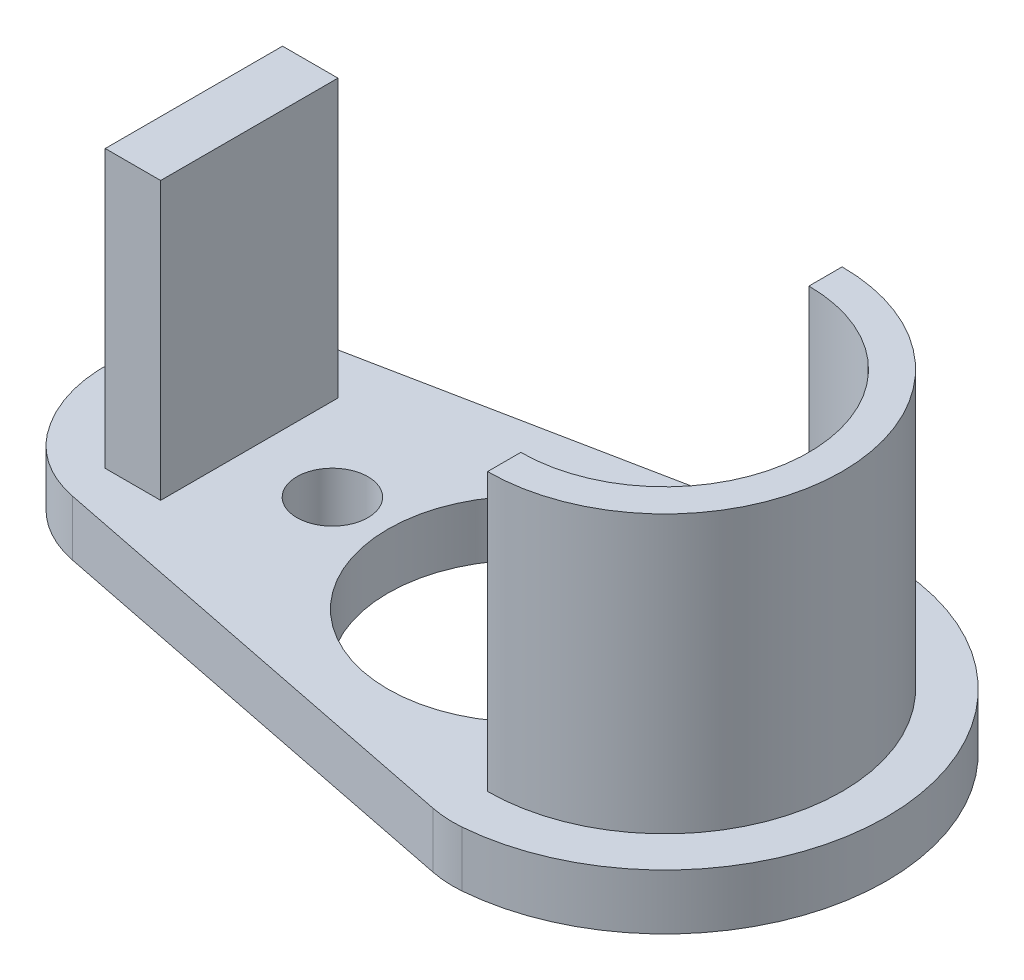
ISO-10303-21;
HEADER;
FILE_DESCRIPTION(('STEP AP214'),'2;1');
FILE_NAME('part.step','',(''),(''),'','','');
FILE_SCHEMA(('AUTOMOTIVE_DESIGN { 1 0 10303 214 1 1 1 1 }'));
ENDSEC;
DATA;
#1=APPLICATION_CONTEXT('core data for automotive mechanical design processes');
#2=APPLICATION_PROTOCOL_DEFINITION('international standard','automotive_design',2000,#1);
#3=PRODUCT_CONTEXT('',#1,'mechanical');
#4=PRODUCT('Part','Part','',(#3));
#5=PRODUCT_RELATED_PRODUCT_CATEGORY('part','',(#4));
#6=PRODUCT_DEFINITION_FORMATION('','',#4);
#7=PRODUCT_DEFINITION_CONTEXT('part definition',#1,'design');
#8=PRODUCT_DEFINITION('design','',#6,#7);
#9=PRODUCT_DEFINITION_SHAPE('','',#8);
#10=(LENGTH_UNIT() NAMED_UNIT(*) SI_UNIT(.MILLI.,.METRE.));
#11=(NAMED_UNIT(*) PLANE_ANGLE_UNIT() SI_UNIT($,.RADIAN.));
#12=(NAMED_UNIT(*) SI_UNIT($,.STERADIAN.) SOLID_ANGLE_UNIT());
#13=UNCERTAINTY_MEASURE_WITH_UNIT(LENGTH_MEASURE(1.E-05),#10,'distance_accuracy_value','');
#14=(GEOMETRIC_REPRESENTATION_CONTEXT(3) GLOBAL_UNCERTAINTY_ASSIGNED_CONTEXT((#13)) GLOBAL_UNIT_ASSIGNED_CONTEXT((#10,
#11,#12)) REPRESENTATION_CONTEXT('',''));
#15=CARTESIAN_POINT('',(0.,0.,0.));
#16=DIRECTION('',(0.,0.,1.));
#17=DIRECTION('',(1.,0.,0.));
#18=AXIS2_PLACEMENT_3D('',#15,#16,#17);
#19=CARTESIAN_POINT('',(0.,0.5,0.));
#20=DIRECTION('',(0.,1.,0.));
#21=DIRECTION('',(0.,0.,1.));
#22=AXIS2_PLACEMENT_3D('',#19,#20,#21);
#23=PLANE('',#22);
#24=CARTESIAN_POINT('',(-3.,0.5,0.));
#25=DIRECTION('',(0.,1.,0.));
#26=DIRECTION('',(0.,0.,1.));
#27=AXIS2_PLACEMENT_3D('',#24,#25,#26);
#28=CIRCLE('',#27,0.3207);
#29=CARTESIAN_POINT('',(-3.,0.5,0.3207));
#30=VERTEX_POINT('',#29);
#31=EDGE_CURVE('E239',#30,#30,#28,.T.);
#32=ORIENTED_EDGE('',*,*,#31,.F.);
#33=EDGE_LOOP('',(#32));
#34=FACE_BOUND('',#33,.T.);
#35=CARTESIAN_POINT('',(-1.24999999999968,0.5,0.));
#36=DIRECTION('',(0.,1.,0.));
#37=DIRECTION('',(0.,0.,1.));
#38=AXIS2_PLACEMENT_3D('',#35,#36,#37);
#39=CIRCLE('',#38,1.24999999999969);
#40=CARTESIAN_POINT('',(-1.24999999999968,0.5,1.24999999999969));
#41=VERTEX_POINT('',#40);
#42=EDGE_CURVE('E236',#41,#41,#39,.T.);
#43=ORIENTED_EDGE('',*,*,#42,.F.);
#44=EDGE_LOOP('',(#43));
#45=FACE_BOUND('',#44,.T.);
#46=CARTESIAN_POINT('',(0.5,0.5,0.));
#47=DIRECTION('',(0.,1.,0.));
#48=DIRECTION('',(0.,0.,1.));
#49=AXIS2_PLACEMENT_3D('',#46,#47,#48);
#50=CIRCLE('',#49,0.3207);
#51=CARTESIAN_POINT('',(0.5,0.5,0.3207));
#52=VERTEX_POINT('',#51);
#53=EDGE_CURVE('E233',#52,#52,#50,.T.);
#54=ORIENTED_EDGE('',*,*,#53,.F.);
#55=EDGE_LOOP('',(#54));
#56=FACE_BOUND('',#55,.T.);
#57=DIRECTION('',(-0.980617043355843,0.,0.195934209060197));
#58=VECTOR('',#57,1.);
#59=CARTESIAN_POINT('',(-0.384272849561752,0.5,-1.92321957143991));
#60=LINE('',#59,#58);
#61=CARTESIAN_POINT('',(-0.113883759060197,0.5,-1.97724522084595));
#62=VERTEX_POINT('',#61);
#63=CARTESIAN_POINT('',(-4.183235690524,0.5,-1.16415997265328));
#64=VERTEX_POINT('',#63);
#65=EDGE_CURVE('E212',#62,#64,#60,.T.);
#66=ORIENTED_EDGE('',*,*,#65,.T.);
#67=CARTESIAN_POINT('',(-3.9873014814638,0.5,-0.183542929297438));
#68=DIRECTION('',(0.,1.,0.));
#69=DIRECTION('',(0.,0.,1.));
#70=AXIS2_PLACEMENT_3D('',#67,#68,#69);
#71=CIRCLE('',#70,1.);
#72=CARTESIAN_POINT('',(-4.77830641967648,0.5,-0.795352693622231));
#73=VERTEX_POINT('',#72);
#74=EDGE_CURVE('E215',#64,#73,#71,.T.);
#75=ORIENTED_EDGE('',*,*,#74,.T.);
#76=CARTESIAN_POINT('',(-3.75,0.5,0.));
#77=DIRECTION('',(0.,1.,0.));
#78=DIRECTION('',(0.,0.,1.));
#79=AXIS2_PLACEMENT_3D('',#76,#77,#78);
#80=CIRCLE('',#79,1.3);
#81=CARTESIAN_POINT('',(-4.77830641967648,0.5,0.795352693622231));
#82=VERTEX_POINT('',#81);
#83=EDGE_CURVE('E218',#73,#82,#80,.T.);
#84=ORIENTED_EDGE('',*,*,#83,.T.);
#85=CARTESIAN_POINT('',(-3.9873014814638,0.5,0.183542929297438));
#86=DIRECTION('',(0.,1.,0.));
#87=DIRECTION('',(0.,0.,1.));
#88=AXIS2_PLACEMENT_3D('',#85,#86,#87);
#89=CIRCLE('',#88,1.);
#90=CARTESIAN_POINT('',(-4.183235690524,0.5,1.16415997265328));
#91=VERTEX_POINT('',#90);
#92=EDGE_CURVE('E220',#91,#82,#89,.F.);
#93=ORIENTED_EDGE('',*,*,#92,.F.);
#94=DIRECTION('',(-0.980617043355843,0.,-0.195934209060197));
#95=VECTOR('',#94,1.);
#96=CARTESIAN_POINT('',(-0.384272849561752,0.5,1.92321957143991));
#97=LINE('',#96,#95);
#98=CARTESIAN_POINT('',(-0.113883759971435,0.5,1.97724522066388));
#99=VERTEX_POINT('',#98);
#100=EDGE_CURVE('E223',#99,#91,#97,.T.);
#101=ORIENTED_EDGE('',*,*,#100,.F.);
#102=CARTESIAN_POINT('',(0.0820504490887623,0.5,0.996628177308034));
#103=DIRECTION('',(0.,1.,0.));
#104=DIRECTION('',(0.,0.,1.));
#105=AXIS2_PLACEMENT_3D('',#102,#103,#104);
#106=CIRCLE('',#105,1.);
#107=CARTESIAN_POINT('',(0.164100898177525,0.5,1.99325635461607));
#108=VERTEX_POINT('',#107);
#109=EDGE_CURVE('E226',#99,#108,#106,.T.);
#110=ORIENTED_EDGE('',*,*,#109,.T.);
#111=CARTESIAN_POINT('',(-1.05819487287301E-11,0.5,-1.28546370596616E-10));
#112=DIRECTION('',(0.,1.,0.));
#113=DIRECTION('',(0.,0.,1.));
#114=AXIS2_PLACEMENT_3D('',#111,#112,#113);
#115=CIRCLE('',#114,2.00000000012898);
#116=CARTESIAN_POINT('',(0.164100899999999,0.5,-1.99325635472312));
#117=VERTEX_POINT('',#116);
#118=EDGE_CURVE('E228',#117,#108,#115,.F.);
#119=ORIENTED_EDGE('',*,*,#118,.F.);
#120=CARTESIAN_POINT('',(0.0820504499999999,0.5,-0.996628177490106));
#121=DIRECTION('',(0.,1.,0.));
#122=DIRECTION('',(0.,0.,1.));
#123=AXIS2_PLACEMENT_3D('',#120,#121,#122);
#124=CIRCLE('',#123,1.);
#125=EDGE_CURVE('E231',#117,#62,#124,.T.);
#126=ORIENTED_EDGE('',*,*,#125,.T.);
#127=EDGE_LOOP('',(#66,#75,#84,#93,#101,#110,#119,#126));
#128=FACE_BOUND('',#127,.T.);
#129=DIRECTION('',(0.,0.,-1.));
#130=VECTOR('',#129,1.);
#131=CARTESIAN_POINT('',(-3.75,0.5,0.));
#132=LINE('',#131,#130);
#133=CARTESIAN_POINT('',(-3.75,0.5,0.8));
#134=VERTEX_POINT('',#133);
#135=CARTESIAN_POINT('',(-3.75,0.5,-0.8));
#136=VERTEX_POINT('',#135);
#137=EDGE_CURVE('E209',#134,#136,#132,.T.);
#138=ORIENTED_EDGE('',*,*,#137,.F.);
#139=DIRECTION('',(-1.,0.,0.));
#140=VECTOR('',#139,1.);
#141=CARTESIAN_POINT('',(0.,0.5,0.8));
#142=LINE('',#141,#140);
#143=CARTESIAN_POINT('',(-4.25,0.5,0.8));
#144=VERTEX_POINT('',#143);
#145=EDGE_CURVE('E201',#134,#144,#142,.T.);
#146=ORIENTED_EDGE('',*,*,#145,.T.);
#147=DIRECTION('',(0.,0.,-1.));
#148=VECTOR('',#147,1.);
#149=CARTESIAN_POINT('',(-4.25,0.5,0.));
#150=LINE('',#149,#148);
#151=CARTESIAN_POINT('',(-4.25,0.5,-0.8));
#152=VERTEX_POINT('',#151);
#153=EDGE_CURVE('E204',#144,#152,#150,.T.);
#154=ORIENTED_EDGE('',*,*,#153,.T.);
#155=DIRECTION('',(-1.,0.,0.));
#156=VECTOR('',#155,1.);
#157=CARTESIAN_POINT('',(0.,0.5,-0.8));
#158=LINE('',#157,#156);
#159=EDGE_CURVE('E207',#136,#152,#158,.T.);
#160=ORIENTED_EDGE('',*,*,#159,.F.);
#161=EDGE_LOOP('',(#138,#146,#154,#160));
#162=FACE_BOUND('',#161,.T.);
#163=CARTESIAN_POINT('',(-1.05819487287301E-11,0.5,-1.28546370596616E-10));
#164=DIRECTION('',(0.,1.,0.));
#165=DIRECTION('',(0.,0.,1.));
#166=AXIS2_PLACEMENT_3D('',#163,#164,#165);
#167=CIRCLE('',#166,1.3);
#168=CARTESIAN_POINT('',(-1.0582065822565E-11,0.5,1.29999999987145));
#169=VERTEX_POINT('',#168);
#170=CARTESIAN_POINT('',(-1.0582065822565E-11,0.5,-1.30000000012855));
#171=VERTEX_POINT('',#170);
#172=EDGE_CURVE('E51',#169,#171,#167,.T.);
#173=ORIENTED_EDGE('',*,*,#172,.T.);
#174=DIRECTION('',(0.,0.,-1.));
#175=VECTOR('',#174,1.);
#176=CARTESIAN_POINT('',(-1.05825008262379E-11,0.5,0.));
#177=LINE('',#176,#175);
#178=CARTESIAN_POINT('',(-1.05819654371021E-11,0.5,-1.60000000012855));
#179=VERTEX_POINT('',#178);
#180=EDGE_CURVE('E168',#171,#179,#177,.T.);
#181=ORIENTED_EDGE('',*,*,#180,.T.);
#182=CARTESIAN_POINT('',(-1.05819487287301E-11,0.5,-1.28546370596616E-10));
#183=DIRECTION('',(0.,1.,0.));
#184=DIRECTION('',(0.,0.,1.));
#185=AXIS2_PLACEMENT_3D('',#182,#183,#184);
#186=CIRCLE('',#185,1.6);
#187=CARTESIAN_POINT('',(-1.05819487287301E-11,0.5,1.59999999987145));
#188=VERTEX_POINT('',#187);
#189=EDGE_CURVE('E169',#188,#179,#186,.T.);
#190=ORIENTED_EDGE('',*,*,#189,.F.);
#191=DIRECTION('',(0.,0.,-1.));
#192=VECTOR('',#191,1.);
#193=CARTESIAN_POINT('',(-1.05825008262378E-11,0.5,0.));
#194=LINE('',#193,#192);
#195=EDGE_CURVE('E56',#188,#169,#194,.T.);
#196=ORIENTED_EDGE('',*,*,#195,.T.);
#197=EDGE_LOOP('',(#173,#181,#190,#196));
#198=FACE_BOUND('',#197,.T.);
#199=ADVANCED_FACE('F36',(#34,#45,#56,#128,#162,#198),#23,.T.);
#200=CARTESIAN_POINT('',(-0.384272849561752,0.5,-1.92321957143991));
#201=DIRECTION('',(0.195934209060197,0.,0.980617043355843));
#202=DIRECTION('',(0.980617043355843,0.,-0.195934209060197));
#203=AXIS2_PLACEMENT_3D('',#200,#201,#202);
#204=PLANE('',#203);
#205=DIRECTION('',(-0.980617043355843,0.,0.195934209060197));
#206=VECTOR('',#205,1.);
#207=CARTESIAN_POINT('',(-0.384272849561752,0.,-1.92321957143991));
#208=LINE('',#207,#206);
#209=CARTESIAN_POINT('',(-0.113883759060197,0.,-1.97724522084595));
#210=VERTEX_POINT('',#209);
#211=CARTESIAN_POINT('',(-4.183235690524,0.,-1.16415997265328));
#212=VERTEX_POINT('',#211);
#213=EDGE_CURVE('E211',#210,#212,#208,.T.);
#214=ORIENTED_EDGE('',*,*,#213,.T.);
#215=DIRECTION('',(0.,-1.,0.));
#216=VECTOR('',#215,1.);
#217=CARTESIAN_POINT('',(-4.183235690524,0.5,-1.16415997265328));
#218=LINE('',#217,#216);
#219=EDGE_CURVE('E11',#64,#212,#218,.T.);
#220=ORIENTED_EDGE('',*,*,#219,.F.);
#221=ORIENTED_EDGE('',*,*,#65,.F.);
#222=DIRECTION('',(0.,-1.,0.));
#223=VECTOR('',#222,1.);
#224=CARTESIAN_POINT('',(-0.113883759060197,0.5,-1.97724522084595));
#225=LINE('',#224,#223);
#226=EDGE_CURVE('E242',#62,#210,#225,.T.);
#227=ORIENTED_EDGE('',*,*,#226,.T.);
#228=EDGE_LOOP('',(#214,#220,#221,#227));
#229=FACE_BOUND('',#228,.T.);
#230=ADVANCED_FACE('F38',(#229),#204,.F.);
#231=CARTESIAN_POINT('',(-3.9873014814638,0.5,-0.183542929297438));
#232=DIRECTION('',(0.,-1.,0.));
#233=DIRECTION('',(0.,0.,-1.));
#234=AXIS2_PLACEMENT_3D('',#231,#232,#233);
#235=CYLINDRICAL_SURFACE('',#234,1.);
#236=CARTESIAN_POINT('',(-3.9873014814638,0.,-0.183542929297438));
#237=DIRECTION('',(0.,1.,0.));
#238=DIRECTION('',(0.,0.,1.));
#239=AXIS2_PLACEMENT_3D('',#236,#237,#238);
#240=CIRCLE('',#239,1.);
#241=CARTESIAN_POINT('',(-4.77830641967648,0.,-0.795352693622231));
#242=VERTEX_POINT('',#241);
#243=EDGE_CURVE('E245',#212,#242,#240,.T.);
#244=ORIENTED_EDGE('',*,*,#243,.T.);
#245=DIRECTION('',(0.,-1.,0.));
#246=VECTOR('',#245,1.);
#247=CARTESIAN_POINT('',(-4.77830641967648,0.5,-0.795352693622231));
#248=LINE('',#247,#246);
#249=EDGE_CURVE('E44',#73,#242,#248,.T.);
#250=ORIENTED_EDGE('',*,*,#249,.F.);
#251=ORIENTED_EDGE('',*,*,#74,.F.);
#252=ORIENTED_EDGE('',*,*,#219,.T.);
#253=EDGE_LOOP('',(#244,#250,#251,#252));
#254=FACE_BOUND('',#253,.T.);
#255=ADVANCED_FACE('F321',(#254),#235,.T.);
#256=CARTESIAN_POINT('',(-3.75,0.5,0.));
#257=DIRECTION('',(0.,-1.,0.));
#258=DIRECTION('',(0.,0.,-1.));
#259=AXIS2_PLACEMENT_3D('',#256,#257,#258);
#260=CYLINDRICAL_SURFACE('',#259,1.3);
#261=CARTESIAN_POINT('',(-3.75,0.,0.));
#262=DIRECTION('',(0.,1.,0.));
#263=DIRECTION('',(0.,0.,1.));
#264=AXIS2_PLACEMENT_3D('',#261,#262,#263);
#265=CIRCLE('',#264,1.3);
#266=CARTESIAN_POINT('',(-4.77830641967648,0.,0.795352693622231));
#267=VERTEX_POINT('',#266);
#268=EDGE_CURVE('E247',#242,#267,#265,.T.);
#269=ORIENTED_EDGE('',*,*,#268,.T.);
#270=DIRECTION('',(0.,-1.,0.));
#271=VECTOR('',#270,1.);
#272=CARTESIAN_POINT('',(-4.77830641967648,0.5,0.795352693622231));
#273=LINE('',#272,#271);
#274=EDGE_CURVE('E282',#82,#267,#273,.T.);
#275=ORIENTED_EDGE('',*,*,#274,.F.);
#276=ORIENTED_EDGE('',*,*,#83,.F.);
#277=ORIENTED_EDGE('',*,*,#249,.T.);
#278=EDGE_LOOP('',(#269,#275,#276,#277));
#279=FACE_BOUND('',#278,.T.);
#280=ADVANCED_FACE('F288',(#279),#260,.T.);
#281=CARTESIAN_POINT('',(-3.9873014814638,0.5,0.183542929297438));
#282=DIRECTION('',(0.,-1.,0.));
#283=DIRECTION('',(0.,0.,-1.));
#284=AXIS2_PLACEMENT_3D('',#281,#282,#283);
#285=CYLINDRICAL_SURFACE('',#284,1.);
#286=CARTESIAN_POINT('',(-3.9873014814638,0.,0.183542929297438));
#287=DIRECTION('',(0.,1.,0.));
#288=DIRECTION('',(0.,0.,1.));
#289=AXIS2_PLACEMENT_3D('',#286,#287,#288);
#290=CIRCLE('',#289,1.);
#291=CARTESIAN_POINT('',(-4.183235690524,0.,1.16415997265328));
#292=VERTEX_POINT('',#291);
#293=EDGE_CURVE('E250',#292,#267,#290,.F.);
#294=ORIENTED_EDGE('',*,*,#293,.F.);
#295=DIRECTION('',(0.,-1.,0.));
#296=VECTOR('',#295,1.);
#297=CARTESIAN_POINT('',(-4.183235690524,0.5,1.16415997265328));
#298=LINE('',#297,#296);
#299=EDGE_CURVE('E280',#91,#292,#298,.T.);
#300=ORIENTED_EDGE('',*,*,#299,.F.);
#301=ORIENTED_EDGE('',*,*,#92,.T.);
#302=ORIENTED_EDGE('',*,*,#274,.T.);
#303=EDGE_LOOP('',(#294,#300,#301,#302));
#304=FACE_BOUND('',#303,.T.);
#305=ADVANCED_FACE('F298',(#304),#285,.T.);
#306=CARTESIAN_POINT('',(-0.384272849561752,0.5,1.92321957143991));
#307=DIRECTION('',(-0.195934209060197,0.,0.980617043355843));
#308=DIRECTION('',(0.980617043355843,0.,0.195934209060197));
#309=AXIS2_PLACEMENT_3D('',#306,#307,#308);
#310=PLANE('',#309);
#311=DIRECTION('',(-0.980617043355843,0.,-0.195934209060197));
#312=VECTOR('',#311,1.);
#313=CARTESIAN_POINT('',(-0.384272849561752,0.,1.92321957143991));
#314=LINE('',#313,#312);
#315=CARTESIAN_POINT('',(-0.113883759971435,0.,1.97724522066388));
#316=VERTEX_POINT('',#315);
#317=EDGE_CURVE('E253',#316,#292,#314,.T.);
#318=ORIENTED_EDGE('',*,*,#317,.F.);
#319=DIRECTION('',(0.,-1.,0.));
#320=VECTOR('',#319,1.);
#321=CARTESIAN_POINT('',(-0.113883759971435,0.5,1.97724522066388));
#322=LINE('',#321,#320);
#323=EDGE_CURVE('E278',#99,#316,#322,.T.);
#324=ORIENTED_EDGE('',*,*,#323,.F.);
#325=ORIENTED_EDGE('',*,*,#100,.T.);
#326=ORIENTED_EDGE('',*,*,#299,.T.);
#327=EDGE_LOOP('',(#318,#324,#325,#326));
#328=FACE_BOUND('',#327,.T.);
#329=ADVANCED_FACE('F304',(#328),#310,.T.);
#330=CARTESIAN_POINT('',(0.0820504490887623,0.5,0.996628177308034));
#331=DIRECTION('',(0.,-1.,0.));
#332=DIRECTION('',(0.,0.,-1.));
#333=AXIS2_PLACEMENT_3D('',#330,#331,#332);
#334=CYLINDRICAL_SURFACE('',#333,1.);
#335=CARTESIAN_POINT('',(0.0820504490887623,0.,0.996628177308034));
#336=DIRECTION('',(0.,1.,0.));
#337=DIRECTION('',(0.,0.,1.));
#338=AXIS2_PLACEMENT_3D('',#335,#336,#337);
#339=CIRCLE('',#338,1.);
#340=CARTESIAN_POINT('',(0.164100898177525,0.,1.99325635461607));
#341=VERTEX_POINT('',#340);
#342=EDGE_CURVE('E256',#316,#341,#339,.T.);
#343=ORIENTED_EDGE('',*,*,#342,.T.);
#344=DIRECTION('',(0.,-1.,0.));
#345=VECTOR('',#344,1.);
#346=CARTESIAN_POINT('',(0.164100898177525,0.5,1.99325635461607));
#347=LINE('',#346,#345);
#348=EDGE_CURVE('E276',#108,#341,#347,.T.);
#349=ORIENTED_EDGE('',*,*,#348,.F.);
#350=ORIENTED_EDGE('',*,*,#109,.F.);
#351=ORIENTED_EDGE('',*,*,#323,.T.);
#352=EDGE_LOOP('',(#343,#349,#350,#351));
#353=FACE_BOUND('',#352,.T.);
#354=ADVANCED_FACE('F308',(#353),#334,.T.);
#355=CARTESIAN_POINT('',(-1.05819487287301E-11,0.5,-1.28546370596616E-10));
#356=DIRECTION('',(0.,-1.,0.));
#357=DIRECTION('',(0.,0.,-1.));
#358=AXIS2_PLACEMENT_3D('',#355,#356,#357);
#359=CYLINDRICAL_SURFACE('',#358,2.00000000012898);
#360=CARTESIAN_POINT('',(-1.05819487287301E-11,0.,-1.28546370596616E-10));
#361=DIRECTION('',(0.,1.,0.));
#362=DIRECTION('',(0.,0.,1.));
#363=AXIS2_PLACEMENT_3D('',#360,#361,#362);
#364=CIRCLE('',#363,2.00000000012898);
#365=CARTESIAN_POINT('',(0.164100899999999,0.,-1.99325635472312));
#366=VERTEX_POINT('',#365);
#367=EDGE_CURVE('E259',#366,#341,#364,.F.);
#368=ORIENTED_EDGE('',*,*,#367,.F.);
#369=DIRECTION('',(0.,-1.,0.));
#370=VECTOR('',#369,1.);
#371=CARTESIAN_POINT('',(0.164100899999999,0.5,-1.99325635472312));
#372=LINE('',#371,#370);
#373=EDGE_CURVE('E274',#117,#366,#372,.T.);
#374=ORIENTED_EDGE('',*,*,#373,.F.);
#375=ORIENTED_EDGE('',*,*,#118,.T.);
#376=ORIENTED_EDGE('',*,*,#348,.T.);
#377=EDGE_LOOP('',(#368,#374,#375,#376));
#378=FACE_BOUND('',#377,.T.);
#379=ADVANCED_FACE('F314',(#378),#359,.T.);
#380=CARTESIAN_POINT('',(-1.24999999999968,0.5,0.));
#381=DIRECTION('',(0.,-1.,0.));
#382=DIRECTION('',(0.,0.,-1.));
#383=AXIS2_PLACEMENT_3D('',#380,#381,#382);
#384=CYLINDRICAL_SURFACE('',#383,1.24999999999969);
#385=ORIENTED_EDGE('',*,*,#42,.T.);
#386=EDGE_LOOP('',(#385));
#387=FACE_BOUND('',#386,.T.);
#388=CARTESIAN_POINT('',(-1.24999999999968,0.,0.));
#389=DIRECTION('',(0.,1.,0.));
#390=DIRECTION('',(0.,0.,1.));
#391=AXIS2_PLACEMENT_3D('',#388,#389,#390);
#392=CIRCLE('',#391,1.24999999999969);
#393=CARTESIAN_POINT('',(-1.24999999999968,0.,1.24999999999969));
#394=VERTEX_POINT('',#393);
#395=EDGE_CURVE('E267',#394,#394,#392,.T.);
#396=ORIENTED_EDGE('',*,*,#395,.F.);
#397=EDGE_LOOP('',(#396));
#398=FACE_BOUND('',#397,.T.);
#399=ADVANCED_FACE('F346',(#387,#398),#384,.F.);
#400=CARTESIAN_POINT('',(0.5,0.5,0.));
#401=DIRECTION('',(0.,-1.,0.));
#402=DIRECTION('',(0.,0.,-1.));
#403=AXIS2_PLACEMENT_3D('',#400,#401,#402);
#404=CYLINDRICAL_SURFACE('',#403,0.3207);
#405=ORIENTED_EDGE('',*,*,#53,.T.);
#406=EDGE_LOOP('',(#405));
#407=FACE_BOUND('',#406,.T.);
#408=CARTESIAN_POINT('',(0.5,0.,0.));
#409=DIRECTION('',(0.,1.,0.));
#410=DIRECTION('',(0.,0.,1.));
#411=AXIS2_PLACEMENT_3D('',#408,#409,#410);
#412=CIRCLE('',#411,0.3207);
#413=CARTESIAN_POINT('',(0.5,0.,0.3207));
#414=VERTEX_POINT('',#413);
#415=EDGE_CURVE('E264',#414,#414,#412,.T.);
#416=ORIENTED_EDGE('',*,*,#415,.F.);
#417=EDGE_LOOP('',(#416));
#418=FACE_BOUND('',#417,.T.);
#419=ADVANCED_FACE('F349',(#407,#418),#404,.F.);
#420=CARTESIAN_POINT('',(0.0820504499999999,0.5,-0.996628177490106));
#421=DIRECTION('',(0.,-1.,0.));
#422=DIRECTION('',(0.,0.,-1.));
#423=AXIS2_PLACEMENT_3D('',#420,#421,#422);
#424=CYLINDRICAL_SURFACE('',#423,1.);
#425=CARTESIAN_POINT('',(0.0820504499999999,0.,-0.996628177490106));
#426=DIRECTION('',(0.,1.,0.));
#427=DIRECTION('',(0.,0.,1.));
#428=AXIS2_PLACEMENT_3D('',#425,#426,#427);
#429=CIRCLE('',#428,1.);
#430=EDGE_CURVE('E262',#366,#210,#429,.T.);
#431=ORIENTED_EDGE('',*,*,#430,.T.);
#432=ORIENTED_EDGE('',*,*,#226,.F.);
#433=ORIENTED_EDGE('',*,*,#125,.F.);
#434=ORIENTED_EDGE('',*,*,#373,.T.);
#435=EDGE_LOOP('',(#431,#432,#433,#434));
#436=FACE_BOUND('',#435,.T.);
#437=ADVANCED_FACE('F317',(#436),#424,.T.);
#438=CARTESIAN_POINT('',(-3.,0.5,0.));
#439=DIRECTION('',(0.,-1.,0.));
#440=DIRECTION('',(0.,0.,-1.));
#441=AXIS2_PLACEMENT_3D('',#438,#439,#440);
#442=CYLINDRICAL_SURFACE('',#441,0.3207);
#443=ORIENTED_EDGE('',*,*,#31,.T.);
#444=EDGE_LOOP('',(#443));
#445=FACE_BOUND('',#444,.T.);
#446=CARTESIAN_POINT('',(-3.,0.,0.));
#447=DIRECTION('',(0.,1.,0.));
#448=DIRECTION('',(0.,0.,1.));
#449=AXIS2_PLACEMENT_3D('',#446,#447,#448);
#450=CIRCLE('',#449,0.3207);
#451=CARTESIAN_POINT('',(-3.,0.,0.3207));
#452=VERTEX_POINT('',#451);
#453=EDGE_CURVE('E216',#452,#452,#450,.T.);
#454=ORIENTED_EDGE('',*,*,#453,.F.);
#455=EDGE_LOOP('',(#454));
#456=FACE_BOUND('',#455,.T.);
#457=ADVANCED_FACE('F341',(#445,#456),#442,.F.);
#458=CARTESIAN_POINT('',(0.,0.,0.));
#459=DIRECTION('',(0.,1.,0.));
#460=DIRECTION('',(0.,0.,1.));
#461=AXIS2_PLACEMENT_3D('',#458,#459,#460);
#462=PLANE('',#461);
#463=ORIENTED_EDGE('',*,*,#453,.T.);
#464=EDGE_LOOP('',(#463));
#465=FACE_BOUND('',#464,.T.);
#466=ORIENTED_EDGE('',*,*,#395,.T.);
#467=EDGE_LOOP('',(#466));
#468=FACE_BOUND('',#467,.T.);
#469=ORIENTED_EDGE('',*,*,#415,.T.);
#470=EDGE_LOOP('',(#469));
#471=FACE_BOUND('',#470,.T.);
#472=ORIENTED_EDGE('',*,*,#213,.F.);
#473=ORIENTED_EDGE('',*,*,#430,.F.);
#474=ORIENTED_EDGE('',*,*,#367,.T.);
#475=ORIENTED_EDGE('',*,*,#342,.F.);
#476=ORIENTED_EDGE('',*,*,#317,.T.);
#477=ORIENTED_EDGE('',*,*,#293,.T.);
#478=ORIENTED_EDGE('',*,*,#268,.F.);
#479=ORIENTED_EDGE('',*,*,#243,.F.);
#480=EDGE_LOOP('',(#472,#473,#474,#475,#476,#477,#478,#479));
#481=FACE_BOUND('',#480,.T.);
#482=ADVANCED_FACE('F293',(#465,#468,#471,#481),#462,.F.);
#483=CARTESIAN_POINT('',(-3.75,3.,0.));
#484=DIRECTION('',(1.,0.,0.));
#485=DIRECTION('',(0.,0.,-1.));
#486=AXIS2_PLACEMENT_3D('',#483,#484,#485);
#487=PLANE('',#486);
#488=DIRECTION('',(0.,-1.,0.));
#489=VECTOR('',#488,1.);
#490=CARTESIAN_POINT('',(-3.75,3.,0.8));
#491=LINE('',#490,#489);
#492=CARTESIAN_POINT('',(-3.75,3.,0.8));
#493=VERTEX_POINT('',#492);
#494=EDGE_CURVE('E190',#493,#134,#491,.T.);
#495=ORIENTED_EDGE('',*,*,#494,.T.);
#496=ORIENTED_EDGE('',*,*,#137,.T.);
#497=DIRECTION('',(0.,-1.,0.));
#498=VECTOR('',#497,1.);
#499=CARTESIAN_POINT('',(-3.75,3.,-0.8));
#500=LINE('',#499,#498);
#501=CARTESIAN_POINT('',(-3.75,3.,-0.8));
#502=VERTEX_POINT('',#501);
#503=EDGE_CURVE('E198',#502,#136,#500,.T.);
#504=ORIENTED_EDGE('',*,*,#503,.F.);
#505=DIRECTION('',(0.,0.,1.));
#506=VECTOR('',#505,1.);
#507=CARTESIAN_POINT('',(-3.75,3.,0.));
#508=LINE('',#507,#506);
#509=EDGE_CURVE('E180',#502,#493,#508,.T.);
#510=ORIENTED_EDGE('',*,*,#509,.T.);
#511=EDGE_LOOP('',(#495,#496,#504,#510));
#512=FACE_BOUND('',#511,.T.);
#513=ADVANCED_FACE('F337',(#512),#487,.T.);
#514=CARTESIAN_POINT('',(0.,3.,-0.8));
#515=DIRECTION('',(0.,0.,-1.));
#516=DIRECTION('',(-1.,0.,0.));
#517=AXIS2_PLACEMENT_3D('',#514,#515,#516);
#518=PLANE('',#517);
#519=ORIENTED_EDGE('',*,*,#503,.T.);
#520=ORIENTED_EDGE('',*,*,#159,.T.);
#521=DIRECTION('',(0.,-1.,0.));
#522=VECTOR('',#521,1.);
#523=CARTESIAN_POINT('',(-4.25,3.,-0.8));
#524=LINE('',#523,#522);
#525=CARTESIAN_POINT('',(-4.25,3.,-0.8));
#526=VERTEX_POINT('',#525);
#527=EDGE_CURVE('E195',#526,#152,#524,.T.);
#528=ORIENTED_EDGE('',*,*,#527,.F.);
#529=DIRECTION('',(1.,0.,0.));
#530=VECTOR('',#529,1.);
#531=CARTESIAN_POINT('',(0.,3.,-0.8));
#532=LINE('',#531,#530);
#533=EDGE_CURVE('E183',#526,#502,#532,.T.);
#534=ORIENTED_EDGE('',*,*,#533,.T.);
#535=EDGE_LOOP('',(#519,#520,#528,#534));
#536=FACE_BOUND('',#535,.T.);
#537=ADVANCED_FACE('F405',(#536),#518,.T.);
#538=CARTESIAN_POINT('',(-4.25,3.,0.));
#539=DIRECTION('',(1.,0.,0.));
#540=DIRECTION('',(0.,0.,-1.));
#541=AXIS2_PLACEMENT_3D('',#538,#539,#540);
#542=PLANE('',#541);
#543=ORIENTED_EDGE('',*,*,#153,.F.);
#544=DIRECTION('',(0.,-1.,0.));
#545=VECTOR('',#544,1.);
#546=CARTESIAN_POINT('',(-4.25,3.,0.8));
#547=LINE('',#546,#545);
#548=CARTESIAN_POINT('',(-4.25,3.,0.8));
#549=VERTEX_POINT('',#548);
#550=EDGE_CURVE('E193',#549,#144,#547,.T.);
#551=ORIENTED_EDGE('',*,*,#550,.F.);
#552=DIRECTION('',(0.,0.,1.));
#553=VECTOR('',#552,1.);
#554=CARTESIAN_POINT('',(-4.25,3.,0.));
#555=LINE('',#554,#553);
#556=EDGE_CURVE('E186',#526,#549,#555,.T.);
#557=ORIENTED_EDGE('',*,*,#556,.F.);
#558=ORIENTED_EDGE('',*,*,#527,.T.);
#559=EDGE_LOOP('',(#543,#551,#557,#558));
#560=FACE_BOUND('',#559,.T.);
#561=ADVANCED_FACE('F412',(#560),#542,.F.);
#562=CARTESIAN_POINT('',(0.,3.,0.8));
#563=DIRECTION('',(0.,0.,-1.));
#564=DIRECTION('',(-1.,0.,0.));
#565=AXIS2_PLACEMENT_3D('',#562,#563,#564);
#566=PLANE('',#565);
#567=ORIENTED_EDGE('',*,*,#145,.F.);
#568=ORIENTED_EDGE('',*,*,#494,.F.);
#569=DIRECTION('',(1.,0.,0.));
#570=VECTOR('',#569,1.);
#571=CARTESIAN_POINT('',(0.,3.,0.8));
#572=LINE('',#571,#570);
#573=EDGE_CURVE('E188',#549,#493,#572,.T.);
#574=ORIENTED_EDGE('',*,*,#573,.F.);
#575=ORIENTED_EDGE('',*,*,#550,.T.);
#576=EDGE_LOOP('',(#567,#568,#574,#575));
#577=FACE_BOUND('',#576,.T.);
#578=ADVANCED_FACE('F419',(#577),#566,.F.);
#579=CARTESIAN_POINT('',(0.,3.,0.));
#580=DIRECTION('',(0.,1.,0.));
#581=DIRECTION('',(0.,0.,1.));
#582=AXIS2_PLACEMENT_3D('',#579,#580,#581);
#583=PLANE('',#582);
#584=ORIENTED_EDGE('',*,*,#509,.F.);
#585=ORIENTED_EDGE('',*,*,#533,.F.);
#586=ORIENTED_EDGE('',*,*,#556,.T.);
#587=ORIENTED_EDGE('',*,*,#573,.T.);
#588=EDGE_LOOP('',(#584,#585,#586,#587));
#589=FACE_BOUND('',#588,.T.);
#590=ADVANCED_FACE('F427',(#589),#583,.T.);
#591=CARTESIAN_POINT('',(-1.05825008262379E-11,3.,0.));
#592=DIRECTION('',(1.,0.,0.));
#593=DIRECTION('',(0.,0.,-1.));
#594=AXIS2_PLACEMENT_3D('',#591,#592,#593);
#595=PLANE('',#594);
#596=ORIENTED_EDGE('',*,*,#180,.F.);
#597=DIRECTION('',(0.,-1.,0.));
#598=VECTOR('',#597,1.);
#599=CARTESIAN_POINT('',(-1.0582065822565E-11,3.,-1.30000000012855));
#600=LINE('',#599,#598);
#601=CARTESIAN_POINT('',(-1.0582065822565E-11,3.,-1.30000000012855));
#602=VERTEX_POINT('',#601);
#603=EDGE_CURVE('E151',#602,#171,#600,.T.);
#604=ORIENTED_EDGE('',*,*,#603,.F.);
#605=DIRECTION('',(0.,0.,1.));
#606=VECTOR('',#605,1.);
#607=CARTESIAN_POINT('',(-1.05825008262379E-11,3.,0.));
#608=LINE('',#607,#606);
#609=CARTESIAN_POINT('',(-1.05819654371021E-11,3.,-1.60000000012855));
#610=VERTEX_POINT('',#609);
#611=EDGE_CURVE('E157',#610,#602,#608,.T.);
#612=ORIENTED_EDGE('',*,*,#611,.F.);
#613=DIRECTION('',(0.,-1.,0.));
#614=VECTOR('',#613,1.);
#615=CARTESIAN_POINT('',(-1.05819654371021E-11,3.,-1.60000000012855));
#616=LINE('',#615,#614);
#617=EDGE_CURVE('E544',#610,#179,#616,.T.);
#618=ORIENTED_EDGE('',*,*,#617,.T.);
#619=EDGE_LOOP('',(#596,#604,#612,#618));
#620=FACE_BOUND('',#619,.T.);
#621=ADVANCED_FACE('F167',(#620),#595,.F.);
#622=CARTESIAN_POINT('',(-1.05819487287301E-11,3.,-1.28546370596616E-10));
#623=DIRECTION('',(0.,-1.,0.));
#624=DIRECTION('',(0.,0.,-1.));
#625=AXIS2_PLACEMENT_3D('',#622,#623,#624);
#626=CYLINDRICAL_SURFACE('',#625,1.3);
#627=ORIENTED_EDGE('',*,*,#172,.F.);
#628=DIRECTION('',(0.,-1.,0.));
#629=VECTOR('',#628,1.);
#630=CARTESIAN_POINT('',(-1.0582065822565E-11,3.,1.29999999987145));
#631=LINE('',#630,#629);
#632=CARTESIAN_POINT('',(-1.0582065822565E-11,3.,1.29999999987145));
#633=VERTEX_POINT('',#632);
#634=EDGE_CURVE('E153',#633,#169,#631,.T.);
#635=ORIENTED_EDGE('',*,*,#634,.F.);
#636=CARTESIAN_POINT('',(-1.05819487287301E-11,3.,-1.28546370596616E-10));
#637=DIRECTION('',(0.,1.,0.));
#638=DIRECTION('',(0.,0.,1.));
#639=AXIS2_PLACEMENT_3D('',#636,#637,#638);
#640=CIRCLE('',#639,1.3);
#641=EDGE_CURVE('E147',#602,#633,#640,.F.);
#642=ORIENTED_EDGE('',*,*,#641,.F.);
#643=ORIENTED_EDGE('',*,*,#603,.T.);
#644=EDGE_LOOP('',(#627,#635,#642,#643));
#645=FACE_BOUND('',#644,.T.);
#646=ADVANCED_FACE('F149',(#645),#626,.F.);
#647=CARTESIAN_POINT('',(-1.05825008262378E-11,3.,0.));
#648=DIRECTION('',(1.,0.,0.));
#649=DIRECTION('',(0.,0.,-1.));
#650=AXIS2_PLACEMENT_3D('',#647,#648,#649);
#651=PLANE('',#650);
#652=ORIENTED_EDGE('',*,*,#195,.F.);
#653=DIRECTION('',(0.,-1.,0.));
#654=VECTOR('',#653,1.);
#655=CARTESIAN_POINT('',(-1.05819654371021E-11,3.,1.59999999987145));
#656=LINE('',#655,#654);
#657=CARTESIAN_POINT('',(-1.05819654371021E-11,3.,1.59999999987145));
#658=VERTEX_POINT('',#657);
#659=EDGE_CURVE('E173',#658,#188,#656,.T.);
#660=ORIENTED_EDGE('',*,*,#659,.F.);
#661=DIRECTION('',(0.,0.,1.));
#662=VECTOR('',#661,1.);
#663=CARTESIAN_POINT('',(-1.05825008262378E-11,3.,0.));
#664=LINE('',#663,#662);
#665=EDGE_CURVE('E156',#633,#658,#664,.T.);
#666=ORIENTED_EDGE('',*,*,#665,.F.);
#667=ORIENTED_EDGE('',*,*,#634,.T.);
#668=EDGE_LOOP('',(#652,#660,#666,#667));
#669=FACE_BOUND('',#668,.T.);
#670=ADVANCED_FACE('F448',(#669),#651,.F.);
#671=CARTESIAN_POINT('',(-1.05819487287301E-11,3.,-1.28546370596616E-10));
#672=DIRECTION('',(0.,-1.,0.));
#673=DIRECTION('',(0.,0.,-1.));
#674=AXIS2_PLACEMENT_3D('',#671,#672,#673);
#675=CYLINDRICAL_SURFACE('',#674,1.6);
#676=ORIENTED_EDGE('',*,*,#659,.T.);
#677=ORIENTED_EDGE('',*,*,#189,.T.);
#678=ORIENTED_EDGE('',*,*,#617,.F.);
#679=CARTESIAN_POINT('',(-1.05819487287301E-11,3.,-1.28546370596616E-10));
#680=DIRECTION('',(0.,1.,0.));
#681=DIRECTION('',(0.,0.,1.));
#682=AXIS2_PLACEMENT_3D('',#679,#680,#681);
#683=CIRCLE('',#682,1.6);
#684=EDGE_CURVE('E163',#610,#658,#683,.F.);
#685=ORIENTED_EDGE('',*,*,#684,.T.);
#686=EDGE_LOOP('',(#676,#677,#678,#685));
#687=FACE_BOUND('',#686,.T.);
#688=ADVANCED_FACE('F455',(#687),#675,.T.);
#689=CARTESIAN_POINT('',(0.,3.,0.));
#690=DIRECTION('',(0.,1.,0.));
#691=DIRECTION('',(0.,0.,1.));
#692=AXIS2_PLACEMENT_3D('',#689,#690,#691);
#693=PLANE('',#692);
#694=ORIENTED_EDGE('',*,*,#611,.T.);
#695=ORIENTED_EDGE('',*,*,#641,.T.);
#696=ORIENTED_EDGE('',*,*,#665,.T.);
#697=ORIENTED_EDGE('',*,*,#684,.F.);
#698=EDGE_LOOP('',(#694,#695,#696,#697));
#699=FACE_BOUND('',#698,.T.);
#700=ADVANCED_FACE('F161',(#699),#693,.T.);
#701=CLOSED_SHELL('',(#199,#230,#255,#280,#305,#329,#354,#379,#399,#419,#437,#457,#482,#513,
#537,#561,#578,#590,#621,#646,#670,#688,#700));
#702=MANIFOLD_SOLID_BREP('B2',#701);
#703=ADVANCED_BREP_SHAPE_REPRESENTATION('',(#18,#702),#14);
#704=SHAPE_DEFINITION_REPRESENTATION(#9,#703);
ENDSEC;
END-ISO-10303-21;
